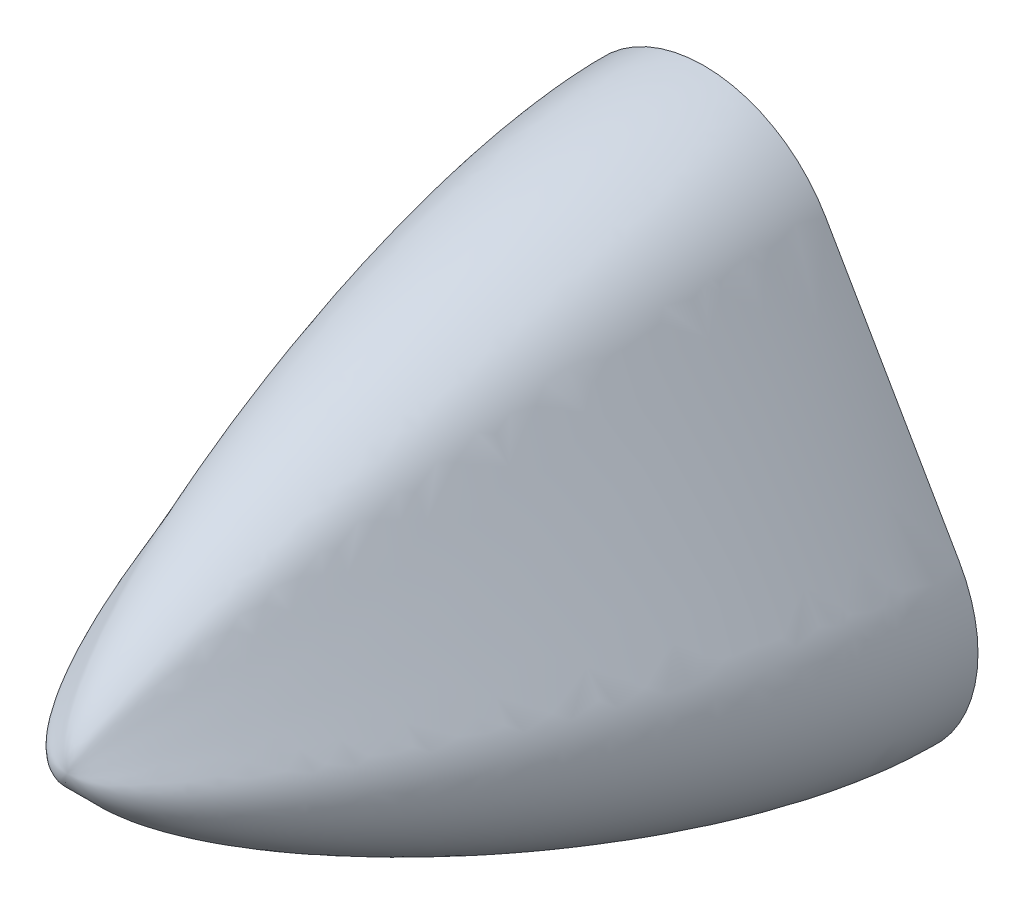
ISO-10303-21;
HEADER;
FILE_DESCRIPTION(('STEP AP214'),'2;1');
FILE_NAME('part.step','',(''),(''),'','','');
FILE_SCHEMA(('AUTOMOTIVE_DESIGN { 1 0 10303 214 1 1 1 1 }'));
ENDSEC;
DATA;
#1=APPLICATION_CONTEXT('core data for automotive mechanical design processes');
#2=APPLICATION_PROTOCOL_DEFINITION('international standard','automotive_design',2000,#1);
#3=PRODUCT_CONTEXT('',#1,'mechanical');
#4=PRODUCT('Part','Part','',(#3));
#5=PRODUCT_RELATED_PRODUCT_CATEGORY('part','',(#4));
#6=PRODUCT_DEFINITION_FORMATION('','',#4);
#7=PRODUCT_DEFINITION_CONTEXT('part definition',#1,'design');
#8=PRODUCT_DEFINITION('design','',#6,#7);
#9=PRODUCT_DEFINITION_SHAPE('','',#8);
#10=(LENGTH_UNIT() NAMED_UNIT(*) SI_UNIT(.MILLI.,.METRE.));
#11=(NAMED_UNIT(*) PLANE_ANGLE_UNIT() SI_UNIT($,.RADIAN.));
#12=(NAMED_UNIT(*) SI_UNIT($,.STERADIAN.) SOLID_ANGLE_UNIT());
#13=UNCERTAINTY_MEASURE_WITH_UNIT(LENGTH_MEASURE(1.E-05),#10,'distance_accuracy_value','');
#14=(GEOMETRIC_REPRESENTATION_CONTEXT(3) GLOBAL_UNCERTAINTY_ASSIGNED_CONTEXT((#13)) GLOBAL_UNIT_ASSIGNED_CONTEXT((#10,
#11,#12)) REPRESENTATION_CONTEXT('',''));
#15=CARTESIAN_POINT('',(0.,0.,0.));
#16=DIRECTION('',(0.,0.,1.));
#17=DIRECTION('',(1.,0.,0.));
#18=AXIS2_PLACEMENT_3D('',#15,#16,#17);
#19=CARTESIAN_POINT('',(-10.5,-6.06217782649107,0.));
#20=DIRECTION('',(0.,0.,1.));
#21=DIRECTION('',(1.,0.,0.));
#22=AXIS2_PLACEMENT_3D('',#19,#20,#21);
#23=PLANE('',#22);
#24=CARTESIAN_POINT('',(-10.5,-6.06217782649107,0.));
#25=DIRECTION('',(0.,0.,1.));
#26=DIRECTION('',(1.,0.,0.));
#27=AXIS2_PLACEMENT_3D('',#24,#25,#26);
#28=CIRCLE('',#27,11.);
#29=CARTESIAN_POINT('',(-20.0262794416288,-0.562177826491066,0.));
#30=VERTEX_POINT('',#29);
#31=CARTESIAN_POINT('',(-10.5,-17.0621778264911,0.));
#32=VERTEX_POINT('',#31);
#33=EDGE_CURVE('E228',#30,#32,#28,.T.);
#34=ORIENTED_EDGE('',*,*,#33,.F.);
#35=DIRECTION('',(-0.5,-0.866025403784439,0.));
#36=VECTOR('',#35,1.);
#37=CARTESIAN_POINT('',(-20.0262794416288,-0.562177826491066,0.));
#38=LINE('',#37,#36);
#39=CARTESIAN_POINT('',(-9.52627944162883,17.6243556529821,0.));
#40=VERTEX_POINT('',#39);
#41=EDGE_CURVE('E12',#40,#30,#38,.T.);
#42=ORIENTED_EDGE('',*,*,#41,.F.);
#43=CARTESIAN_POINT('',(0.,12.1243556529821,0.));
#44=DIRECTION('',(0.,0.,1.));
#45=DIRECTION('',(1.,0.,0.));
#46=AXIS2_PLACEMENT_3D('',#43,#44,#45);
#47=CIRCLE('',#46,11.);
#48=CARTESIAN_POINT('',(9.52627944162883,17.6243556529821,0.));
#49=VERTEX_POINT('',#48);
#50=EDGE_CURVE('E199',#49,#40,#47,.T.);
#51=ORIENTED_EDGE('',*,*,#50,.F.);
#52=DIRECTION('',(-0.5,0.866025403784439,0.));
#53=VECTOR('',#52,1.);
#54=CARTESIAN_POINT('',(9.52627944162883,17.6243556529821,0.));
#55=LINE('',#54,#53);
#56=CARTESIAN_POINT('',(20.0262794416288,-0.562177826491073,0.));
#57=VERTEX_POINT('',#56);
#58=EDGE_CURVE('E249',#57,#49,#55,.T.);
#59=ORIENTED_EDGE('',*,*,#58,.F.);
#60=CARTESIAN_POINT('',(10.5,-6.06217782649107,0.));
#61=DIRECTION('',(0.,0.,1.));
#62=DIRECTION('',(1.,0.,0.));
#63=AXIS2_PLACEMENT_3D('',#60,#61,#62);
#64=CIRCLE('',#63,11.);
#65=CARTESIAN_POINT('',(10.5,-17.0621778264911,0.));
#66=VERTEX_POINT('',#65);
#67=EDGE_CURVE('E238',#66,#57,#64,.T.);
#68=ORIENTED_EDGE('',*,*,#67,.F.);
#69=DIRECTION('',(1.,0.,0.));
#70=VECTOR('',#69,1.);
#71=CARTESIAN_POINT('',(10.5,-17.0621778264911,0.));
#72=LINE('',#71,#70);
#73=EDGE_CURVE('E210',#32,#66,#72,.T.);
#74=ORIENTED_EDGE('',*,*,#73,.F.);
#75=EDGE_LOOP('',(#34,#42,#51,#59,#68,#74));
#76=FACE_BOUND('',#75,.T.);
#77=ADVANCED_FACE('F186',(#76),#23,.F.);
#78=CARTESIAN_POINT('',(-9.52627944435234,17.6243556482649,0.));
#79=CARTESIAN_POINT('',(-9.52627944435234,17.6243556482649,17.9547824395632));
#80=CARTESIAN_POINT('',(-3.17542648145078,5.8747852160883,50.));
#81=CARTESIAN_POINT('',(0.,0.,50.));
#82=CARTESIAN_POINT('',(-10.4012794416288,16.1088111963594,0.));
#83=CARTESIAN_POINT('',(-10.4012794416288,16.1088111963594,17.8500850735912));
#84=CARTESIAN_POINT('',(-3.49178180754648,5.38386753807667,50.));
#85=CARTESIAN_POINT('',(0.,0.,50.));
#86=CARTESIAN_POINT('',(-12.1512794416288,13.0777222831139,0.));
#87=CARTESIAN_POINT('',(-12.1512794416288,13.0777222831139,17.6639495755128));
#88=CARTESIAN_POINT('',(-4.03808184722648,4.35210938312731,50.));
#89=CARTESIAN_POINT('',(0.,0.,50.));
#90=CARTESIAN_POINT('',(-14.7762794416288,8.53108891324554,0.));
#91=CARTESIAN_POINT('',(-14.7762794416288,8.53108891324554,17.583541070271));
#92=CARTESIAN_POINT('',(-4.93159970664527,2.84726041816712,50.));
#93=CARTESIAN_POINT('',(0.,0.,50.));
#94=CARTESIAN_POINT('',(-17.4012794416288,3.98445554337724,0.));
#95=CARTESIAN_POINT('',(-17.4012794416288,3.98445554337724,17.6639495755128));
#96=CARTESIAN_POINT('',(-5.78807820945009,1.32102677069528,50.));
#97=CARTESIAN_POINT('',(0.,0.,50.));
#98=CARTESIAN_POINT('',(-19.1512794416288,0.953366630131702,0.));
#99=CARTESIAN_POINT('',(-19.1512794416288,0.953366630131702,17.8500850735912));
#100=CARTESIAN_POINT('',(-6.40845696235801,0.332037980769266,50.));
#101=CARTESIAN_POINT('',(0.,0.,50.));
#102=CARTESIAN_POINT('',(-20.5062449817098,-1.3935025277936,0.));
#103=CARTESIAN_POINT('',(-20.5062449817098,-1.3935025277936,18.012212300415));
#104=CARTESIAN_POINT('',(-6.82186781640195,-0.472316932866779,50.));
#105=CARTESIAN_POINT('',(0.,0.,50.));
#106=CARTESIAN_POINT('',(-21.2473637970838,-3.18238841424645,0.));
#107=CARTESIAN_POINT('',(-21.2473637970838,-3.18238841424645,18.1340704327682));
#108=CARTESIAN_POINT('',(-7.08874186691024,-1.05717155720533,50.));
#109=CARTESIAN_POINT('',(0.,0.,50.));
#110=CARTESIAN_POINT('',(-21.6264263206896,-6.062188833252,0.));
#111=CARTESIAN_POINT('',(-21.6264263206896,-6.062188833252,18.2619406798986));
#112=CARTESIAN_POINT('',(-7.207124102227,-2.02169150874953,50.));
#113=CARTESIAN_POINT('',(0.,0.,50.));
#114=CARTESIAN_POINT('',(-21.2473359469835,-8.94190057656169,0.));
#115=CARTESIAN_POINT('',(-21.2473359469835,-8.94190057656169,18.3444715777326));
#116=CARTESIAN_POINT('',(-7.08289673312364,-2.98041051573529,50.));
#117=CARTESIAN_POINT('',(0.,0.,50.));
#118=CARTESIAN_POINT('',(-20.1357831704448,-11.6253998338003,0.));
#119=CARTESIAN_POINT('',(-20.1357831704448,-11.6253998338003,18.3719974749721));
#120=CARTESIAN_POINT('',(-6.71180672496804,-3.87506341940904,50.));
#121=CARTESIAN_POINT('',(0.,0.,50.));
#122=CARTESIAN_POINT('',(-18.3675810309089,-13.9297824045491,0.));
#123=CARTESIAN_POINT('',(-18.3675810309089,-13.9297824045491,18.3444715777326));
#124=CARTESIAN_POINT('',(-6.12255958689484,-4.64376324539919,50.));
#125=CARTESIAN_POINT('',(0.,0.,50.));
#126=CARTESIAN_POINT('',(-16.0632226924794,-15.6979401701636,0.));
#127=CARTESIAN_POINT('',(-16.0632226924794,-15.6979401701636,18.2619406798986));
#128=CARTESIAN_POINT('',(-5.35439825630588,-5.23070680638093,50.));
#129=CARTESIAN_POINT('',(0.,0.,50.));
#130=CARTESIAN_POINT('',(-13.3797111099886,-16.8095626046011,0.));
#131=CARTESIAN_POINT('',(-13.3797111099886,-16.8095626046011,18.1340704327682));
#132=CARTESIAN_POINT('',(-4.4599083581533,-5.61044475901195,50.));
#133=CARTESIAN_POINT('',(0.,0.,50.));
#134=CARTESIAN_POINT('',(-11.459931080162,-17.0621778264911,0.));
#135=CARTESIAN_POINT('',(-11.459931080162,-17.0621778264911,18.012212300415));
#136=CARTESIAN_POINT('',(-3.81997237070117,-5.67175236383019,50.));
#137=CARTESIAN_POINT('',(0.,0.,50.));
#138=CARTESIAN_POINT('',(-8.75,-17.0621778264911,0.));
#139=CARTESIAN_POINT('',(-8.75,-17.0621778264911,17.8500850735912));
#140=CARTESIAN_POINT('',(-2.91667515481153,-5.71590551884593,50.));
#141=CARTESIAN_POINT('',(0.,0.,50.));
#142=CARTESIAN_POINT('',(-5.25,-17.0621778264911,0.));
#143=CARTESIAN_POINT('',(-5.25,-17.0621778264911,17.6639495755128));
#144=CARTESIAN_POINT('',(-1.74999636222364,-5.67313615382258,50.));
#145=CARTESIAN_POINT('',(0.,0.,50.));
#146=CARTESIAN_POINT('',(0.,-17.0621778264911,0.));
#147=CARTESIAN_POINT('',(0.,-17.0621778264911,17.583541070271));
#148=CARTESIAN_POINT('',(0.,-5.69452083633424,50.));
#149=CARTESIAN_POINT('',(0.,0.,50.));
#150=CARTESIAN_POINT('',(5.24999999999999,-17.0621778264911,0.));
#151=CARTESIAN_POINT('',(5.24999999999999,-17.0621778264911,17.6639495755128));
#152=CARTESIAN_POINT('',(1.74999636222362,-5.67313615382258,50.));
#153=CARTESIAN_POINT('',(0.,0.,50.));
#154=CARTESIAN_POINT('',(8.74999999999999,-17.0621778264911,0.));
#155=CARTESIAN_POINT('',(8.74999999999999,-17.0621778264911,17.8500850735912));
#156=CARTESIAN_POINT('',(2.91667515481154,-5.71590551884592,50.));
#157=CARTESIAN_POINT('',(0.,0.,50.));
#158=CARTESIAN_POINT('',(11.459931080162,-17.0621778264911,0.));
#159=CARTESIAN_POINT('',(11.459931080162,-17.0621778264911,18.012212300415));
#160=CARTESIAN_POINT('',(3.81997237070116,-5.67175236383017,50.));
#161=CARTESIAN_POINT('',(0.,0.,50.));
#162=CARTESIAN_POINT('',(13.3797111099886,-16.8095626046011,0.));
#163=CARTESIAN_POINT('',(13.3797111099886,-16.8095626046011,18.1340704327682));
#164=CARTESIAN_POINT('',(4.4599083581533,-5.61044475901194,50.));
#165=CARTESIAN_POINT('',(0.,0.,50.));
#166=CARTESIAN_POINT('',(16.0632226924794,-15.6979401701636,0.));
#167=CARTESIAN_POINT('',(16.0632226924794,-15.6979401701636,18.2619406798986));
#168=CARTESIAN_POINT('',(5.35439825630589,-5.23070680638094,50.));
#169=CARTESIAN_POINT('',(0.,0.,50.));
#170=CARTESIAN_POINT('',(18.3675810309089,-13.9297824045491,0.));
#171=CARTESIAN_POINT('',(18.3675810309089,-13.9297824045491,18.3444715777326));
#172=CARTESIAN_POINT('',(6.1225595868948,-4.6437632453992,50.));
#173=CARTESIAN_POINT('',(0.,0.,50.));
#174=CARTESIAN_POINT('',(20.1357831704449,-11.6253998338003,0.));
#175=CARTESIAN_POINT('',(20.1357831704449,-11.6253998338003,18.3719974749721));
#176=CARTESIAN_POINT('',(6.71180672496809,-3.87506341940905,50.));
#177=CARTESIAN_POINT('',(0.,0.,50.));
#178=CARTESIAN_POINT('',(21.2473359469834,-8.9419005765617,0.));
#179=CARTESIAN_POINT('',(21.2473359469834,-8.9419005765617,18.3444715777326));
#180=CARTESIAN_POINT('',(7.08289673312358,-2.98041051573528,50.));
#181=CARTESIAN_POINT('',(0.,0.,50.));
#182=CARTESIAN_POINT('',(21.6264263206896,-6.06218883325201,0.));
#183=CARTESIAN_POINT('',(21.6264263206896,-6.06218883325201,18.2619406798986));
#184=CARTESIAN_POINT('',(7.20712410222703,-2.02169150874954,50.));
#185=CARTESIAN_POINT('',(0.,0.,50.));
#186=CARTESIAN_POINT('',(21.2473637970837,-3.18238841424645,0.));
#187=CARTESIAN_POINT('',(21.2473637970837,-3.18238841424645,18.1340704327682));
#188=CARTESIAN_POINT('',(7.08874186691023,-1.05717155720532,50.));
#189=CARTESIAN_POINT('',(0.,0.,50.));
#190=CARTESIAN_POINT('',(20.5062449817098,-1.39350252779361,0.));
#191=CARTESIAN_POINT('',(20.5062449817098,-1.39350252779361,18.012212300415));
#192=CARTESIAN_POINT('',(6.82186781640195,-0.47231693286678,50.));
#193=CARTESIAN_POINT('',(0.,0.,50.));
#194=CARTESIAN_POINT('',(19.1512794416288,0.953366630131693,0.));
#195=CARTESIAN_POINT('',(19.1512794416288,0.953366630131693,17.8500850735912));
#196=CARTESIAN_POINT('',(6.40845696235801,0.332037980769261,50.));
#197=CARTESIAN_POINT('',(0.,0.,50.));
#198=CARTESIAN_POINT('',(17.4012794416288,3.98445554337723,0.));
#199=CARTESIAN_POINT('',(17.4012794416288,3.98445554337723,17.6639495755128));
#200=CARTESIAN_POINT('',(5.78807820945009,1.32102677069527,50.));
#201=CARTESIAN_POINT('',(0.,0.,50.));
#202=CARTESIAN_POINT('',(14.7762794416288,8.53108891324553,0.));
#203=CARTESIAN_POINT('',(14.7762794416288,8.53108891324553,17.5835410702711));
#204=CARTESIAN_POINT('',(4.93159970664527,2.84726041816713,50.));
#205=CARTESIAN_POINT('',(0.,0.,50.));
#206=CARTESIAN_POINT('',(12.1512794416288,13.0777222831138,0.));
#207=CARTESIAN_POINT('',(12.1512794416288,13.0777222831138,17.6639495755128));
#208=CARTESIAN_POINT('',(4.03808184722648,4.3521093831273,50.));
#209=CARTESIAN_POINT('',(0.,0.,50.));
#210=CARTESIAN_POINT('',(10.4012794416288,16.1088111963594,0.));
#211=CARTESIAN_POINT('',(10.4012794416288,16.1088111963594,17.8500850735912));
#212=CARTESIAN_POINT('',(3.49178180754648,5.38386753807666,50.));
#213=CARTESIAN_POINT('',(0.,0.,50.));
#214=CARTESIAN_POINT('',(9.04631390154783,18.4556803542847,0.));
#215=CARTESIAN_POINT('',(9.04631390154783,18.4556803542847,18.012212300415));
#216=CARTESIAN_POINT('',(3.00189544570079,6.14406929669694,50.));
#217=CARTESIAN_POINT('',(0.,0.,50.));
#218=CARTESIAN_POINT('',(7.86765268709518,19.9919510188475,0.));
#219=CARTESIAN_POINT('',(7.86765268709518,19.9919510188475,18.1340704327682));
#220=CARTESIAN_POINT('',(2.62883350875696,6.66761631621724,50.));
#221=CARTESIAN_POINT('',(0.,0.,50.));
#222=CARTESIAN_POINT('',(5.56320362821023,21.7601290034156,0.));
#223=CARTESIAN_POINT('',(5.56320362821023,21.7601290034156,18.2619406798986));
#224=CARTESIAN_POINT('',(1.85272584592112,7.25239831513047,50.));
#225=CARTESIAN_POINT('',(0.,0.,50.));
#226=CARTESIAN_POINT('',(2.87975491607459,22.8716829811108,0.));
#227=CARTESIAN_POINT('',(2.87975491607459,22.8716829811108,18.3444715777326));
#228=CARTESIAN_POINT('',(0.960337146228771,7.62417376113448,50.));
#229=CARTESIAN_POINT('',(0.,0.,50.));
#230=CARTESIAN_POINT('',(0.,23.2507996676007,0.));
#231=CARTESIAN_POINT('',(0.,23.2507996676007,18.3719974749721));
#232=CARTESIAN_POINT('',(0.,7.75012683881809,50.));
#233=CARTESIAN_POINT('',(0.,0.,50.));
#234=CARTESIAN_POINT('',(-2.87975491607459,22.8716829811108,0.));
#235=CARTESIAN_POINT('',(-2.87975491607459,22.8716829811108,18.3444715777326));
#236=CARTESIAN_POINT('',(-0.960337146228768,7.62417376113448,50.));
#237=CARTESIAN_POINT('',(0.,0.,50.));
#238=CARTESIAN_POINT('',(-5.56320362821023,21.7601290034156,0.));
#239=CARTESIAN_POINT('',(-5.56320362821023,21.7601290034156,18.2619406798986));
#240=CARTESIAN_POINT('',(-1.85272584592112,7.25239831513047,50.));
#241=CARTESIAN_POINT('',(0.,0.,50.));
#242=CARTESIAN_POINT('',(-7.86765268709518,19.9919510188475,0.));
#243=CARTESIAN_POINT('',(-7.86765268709518,19.9919510188475,18.1340704327682));
#244=CARTESIAN_POINT('',(-2.62883350875697,6.66761631621725,50.));
#245=CARTESIAN_POINT('',(0.,0.,50.));
#246=CARTESIAN_POINT('',(-9.04631390154782,18.4556803542847,0.));
#247=CARTESIAN_POINT('',(-9.04631390154782,18.4556803542847,18.012212300415));
#248=CARTESIAN_POINT('',(-3.0018954457008,6.14406929669696,50.));
#249=CARTESIAN_POINT('',(0.,0.,50.));
#250=CARTESIAN_POINT('',(-9.52627944435234,17.6243556482649,0.));
#251=CARTESIAN_POINT('',(-9.52627944435234,17.6243556482649,17.9547824395632));
#252=CARTESIAN_POINT('',(-3.17542648145078,5.8747852160883,50.));
#253=CARTESIAN_POINT('',(0.,0.,50.));
#254=B_SPLINE_SURFACE_WITH_KNOTS('',3,3,((#78,#79,#80,#81),(#82,#83,#84,#85),(#86,#87,#88,#89),
(#90,#91,#92,#93),(#94,#95,#96,#97),(#98,#99,#100,#101),(#102,#103,#104,#105),(#106,#107,#108,
#109),(#110,#111,#112,#113),(#114,#115,#116,#117),(#118,#119,#120,#121),(#122,#123,#124,#125),
(#126,#127,#128,#129),(#130,#131,#132,#133),(#134,#135,#136,#137),(#138,#139,#140,#141),(#142,
#143,#144,#145),(#146,#147,#148,#149),(#150,#151,#152,#153),(#154,#155,#156,#157),(#158,#159,
#160,#161),(#162,#163,#164,#165),(#166,#167,#168,#169),(#170,#171,#172,#173),(#174,#175,#176,
#177),(#178,#179,#180,#181),(#182,#183,#184,#185),(#186,#187,#188,#189),(#190,#191,#192,#193),
(#194,#195,#196,#197),(#198,#199,#200,#201),(#202,#203,#204,#205),(#206,#207,#208,#209),(#210,
#211,#212,#213),(#214,#215,#216,#217),(#218,#219,#220,#221),(#222,#223,#224,#225),(#226,#227,
#228,#229),(#230,#231,#232,#233),(#234,#235,#236,#237),(#238,#239,#240,#241),(#242,#243,#244,
#245),(#246,#247,#248,#249),(#250,#251,#252,#253)),.UNSPECIFIED.,.T.,.F.,.F.,(4,1,1,1,2,1,1,1,1,
1,1,1,2,1,1,1,2,1,1,1,1,1,1,1,2,1,1,1,2,1,1,1,1,1,1,1,4),(4,4),(0.,0.0397380954084897,
0.0794761908169793,0.119214286225469,0.158952381633959,0.18075000059638,0.202547619558802,
0.224345238521224,0.246142857483646,0.267940476446068,0.28973809540849,0.311535714370912,
0.333333333333333,0.373071428741823,0.412809524150313,0.452547619558802,0.492285714967292,
0.514083333929714,0.535880952892136,0.557678571854557,0.579476190816979,0.601273809779401,
0.623071428741823,0.644869047704245,0.666666666666667,0.706404762075156,0.746142857483646,
0.785880952892136,0.825619048300625,0.847416667263047,0.869214286225469,0.891011905187891,
0.912809524150312,0.934607143112735,0.956404762075156,0.978202381037578,1.),(0.,1.),.UNSPECIFIED.);
#255=CARTESIAN_POINT('',(0.,0.,50.));
#256=VERTEX_POINT('',#255);
#257=VERTEX_LOOP('',#256);
#258=FACE_BOUND('',#257,.T.);
#259=ORIENTED_EDGE('',*,*,#41,.T.);
#260=ORIENTED_EDGE('',*,*,#33,.T.);
#261=ORIENTED_EDGE('',*,*,#73,.T.);
#262=ORIENTED_EDGE('',*,*,#67,.T.);
#263=ORIENTED_EDGE('',*,*,#58,.T.);
#264=ORIENTED_EDGE('',*,*,#50,.T.);
#265=EDGE_LOOP('',(#259,#260,#261,#262,#263,#264));
#266=FACE_BOUND('',#265,.T.);
#267=ADVANCED_FACE('F188',(#258,#266),#254,.T.);
#268=CLOSED_SHELL('',(#77,#267));
#269=MANIFOLD_SOLID_BREP('B2',#268);
#270=ADVANCED_BREP_SHAPE_REPRESENTATION('',(#18,#269),#14);
#271=SHAPE_DEFINITION_REPRESENTATION(#9,#270);
ENDSEC;
END-ISO-10303-21;
